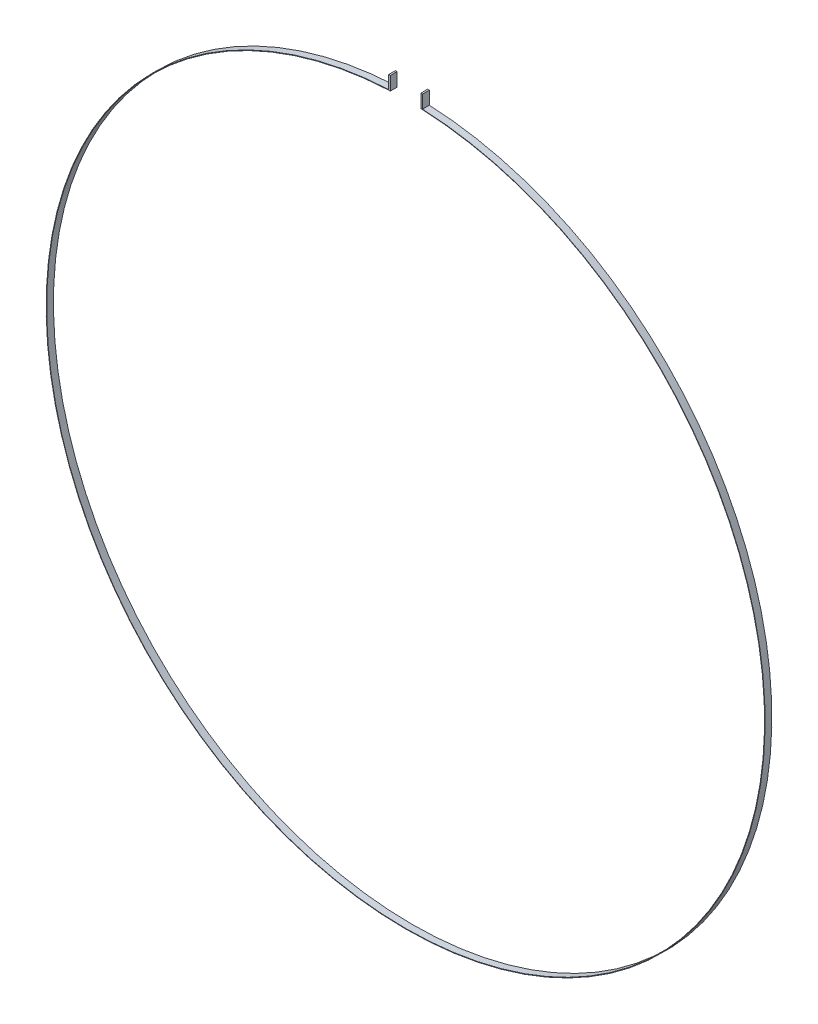
ISO-10303-21;
HEADER;
FILE_DESCRIPTION(('STEP AP214'),'2;1');
FILE_NAME('part.step','',(''),(''),'','','');
FILE_SCHEMA(('AUTOMOTIVE_DESIGN { 1 0 10303 214 1 1 1 1 }'));
ENDSEC;
DATA;
#1=APPLICATION_CONTEXT('core data for automotive mechanical design processes');
#2=APPLICATION_PROTOCOL_DEFINITION('international standard','automotive_design',2000,#1);
#3=PRODUCT_CONTEXT('',#1,'mechanical');
#4=PRODUCT('Part','Part','',(#3));
#5=PRODUCT_RELATED_PRODUCT_CATEGORY('part','',(#4));
#6=PRODUCT_DEFINITION_FORMATION('','',#4);
#7=PRODUCT_DEFINITION_CONTEXT('part definition',#1,'design');
#8=PRODUCT_DEFINITION('design','',#6,#7);
#9=PRODUCT_DEFINITION_SHAPE('','',#8);
#10=(LENGTH_UNIT() NAMED_UNIT(*) SI_UNIT(.MILLI.,.METRE.));
#11=(NAMED_UNIT(*) PLANE_ANGLE_UNIT() SI_UNIT($,.RADIAN.));
#12=(NAMED_UNIT(*) SI_UNIT($,.STERADIAN.) SOLID_ANGLE_UNIT());
#13=UNCERTAINTY_MEASURE_WITH_UNIT(LENGTH_MEASURE(1.E-05),#10,'distance_accuracy_value','');
#14=(GEOMETRIC_REPRESENTATION_CONTEXT(3) GLOBAL_UNCERTAINTY_ASSIGNED_CONTEXT((#13)) GLOBAL_UNIT_ASSIGNED_CONTEXT((#10,
#11,#12)) REPRESENTATION_CONTEXT('',''));
#15=CARTESIAN_POINT('',(0.,0.,0.));
#16=DIRECTION('',(0.,0.,1.));
#17=DIRECTION('',(1.,0.,0.));
#18=AXIS2_PLACEMENT_3D('',#15,#16,#17);
#19=CARTESIAN_POINT('',(49.9999999999992,1058.82009803366,20.));
#20=DIRECTION('',(0.,1.,0.));
#21=DIRECTION('',(0.,0.,1.));
#22=AXIS2_PLACEMENT_3D('',#19,#20,#21);
#23=PLANE('',#22);
#24=DIRECTION('',(1.,0.,0.));
#25=VECTOR('',#24,1.);
#26=CARTESIAN_POINT('',(49.9999999999992,1058.82009803366,20.));
#27=LINE('',#26,#25);
#28=CARTESIAN_POINT('',(44.9999999999992,1058.82009803366,20.));
#29=VERTEX_POINT('',#28);
#30=CARTESIAN_POINT('',(49.9999999999992,1058.82009803366,20.));
#31=VERTEX_POINT('',#30);
#32=EDGE_CURVE('E121',#29,#31,#27,.T.);
#33=ORIENTED_EDGE('',*,*,#32,.F.);
#34=DIRECTION('',(0.,0.,-1.));
#35=VECTOR('',#34,1.);
#36=CARTESIAN_POINT('',(44.9999999999992,1058.82009803366,20.));
#37=LINE('',#36,#35);
#38=CARTESIAN_POINT('',(44.9999999999992,1058.82009803366,0.));
#39=VERTEX_POINT('',#38);
#40=EDGE_CURVE('E108',#29,#39,#37,.T.);
#41=ORIENTED_EDGE('',*,*,#40,.T.);
#42=DIRECTION('',(1.,0.,0.));
#43=VECTOR('',#42,1.);
#44=CARTESIAN_POINT('',(49.9999999999992,1058.82009803366,0.));
#45=LINE('',#44,#43);
#46=CARTESIAN_POINT('',(49.9999999999992,1058.82009803366,0.));
#47=VERTEX_POINT('',#46);
#48=EDGE_CURVE('E145',#39,#47,#45,.T.);
#49=ORIENTED_EDGE('',*,*,#48,.T.);
#50=DIRECTION('',(0.,0.,-1.));
#51=VECTOR('',#50,1.);
#52=CARTESIAN_POINT('',(49.9999999999992,1058.82009803366,20.));
#53=LINE('',#52,#51);
#54=EDGE_CURVE('E128',#31,#47,#53,.T.);
#55=ORIENTED_EDGE('',*,*,#54,.F.);
#56=EDGE_LOOP('',(#33,#41,#49,#55));
#57=FACE_BOUND('',#56,.T.);
#58=ADVANCED_FACE('F34',(#57),#23,.F.);
#59=CARTESIAN_POINT('',(50.0000000000006,1098.82009803366,20.));
#60=DIRECTION('',(0.,-1.,0.));
#61=DIRECTION('',(0.,0.,-1.));
#62=AXIS2_PLACEMENT_3D('',#59,#60,#61);
#63=PLANE('',#62);
#64=DIRECTION('',(-1.,0.,0.));
#65=VECTOR('',#64,1.);
#66=CARTESIAN_POINT('',(50.0000000000006,1098.82009803366,0.));
#67=LINE('',#66,#65);
#68=CARTESIAN_POINT('',(50.0000000000006,1098.82009803366,0.));
#69=VERTEX_POINT('',#68);
#70=CARTESIAN_POINT('',(44.9999999999992,1098.82009803366,0.));
#71=VERTEX_POINT('',#70);
#72=EDGE_CURVE('E136',#69,#71,#67,.T.);
#73=ORIENTED_EDGE('',*,*,#72,.T.);
#74=DIRECTION('',(0.,0.,1.));
#75=VECTOR('',#74,1.);
#76=CARTESIAN_POINT('',(44.9999999999992,1098.82009803366,20.));
#77=LINE('',#76,#75);
#78=CARTESIAN_POINT('',(44.9999999999992,1098.82009803366,20.));
#79=VERTEX_POINT('',#78);
#80=EDGE_CURVE('E11',#71,#79,#77,.T.);
#81=ORIENTED_EDGE('',*,*,#80,.T.);
#82=DIRECTION('',(-1.,0.,0.));
#83=VECTOR('',#82,1.);
#84=CARTESIAN_POINT('',(50.0000000000006,1098.82009803366,20.));
#85=LINE('',#84,#83);
#86=CARTESIAN_POINT('',(50.0000000000006,1098.82009803366,20.));
#87=VERTEX_POINT('',#86);
#88=EDGE_CURVE('E124',#87,#79,#85,.T.);
#89=ORIENTED_EDGE('',*,*,#88,.F.);
#90=DIRECTION('',(0.,0.,-1.));
#91=VECTOR('',#90,1.);
#92=CARTESIAN_POINT('',(50.0000000000006,1098.82009803366,20.));
#93=LINE('',#92,#91);
#94=EDGE_CURVE('E156',#87,#69,#93,.T.);
#95=ORIENTED_EDGE('',*,*,#94,.T.);
#96=EDGE_LOOP('',(#73,#81,#89,#95));
#97=FACE_BOUND('',#96,.T.);
#98=ADVANCED_FACE('F201',(#97),#63,.F.);
#99=CARTESIAN_POINT('',(0.,0.,20.));
#100=DIRECTION('',(0.,0.,-1.));
#101=DIRECTION('',(-1.,0.,0.));
#102=AXIS2_PLACEMENT_3D('',#99,#100,#101);
#103=CYLINDRICAL_SURFACE('',#102,1061.5);
#104=DIRECTION('',(0.,0.,-1.));
#105=VECTOR('',#104,1.);
#106=CARTESIAN_POINT('',(-50.0000000000008,1060.32176720088,20.));
#107=LINE('',#106,#105);
#108=CARTESIAN_POINT('',(-50.0000000000008,1060.32176720088,0.));
#109=VERTEX_POINT('',#108);
#110=CARTESIAN_POINT('',(-50.0000000000008,1060.32176720088,20.));
#111=VERTEX_POINT('',#110);
#112=EDGE_CURVE('E165',#109,#111,#107,.F.);
#113=ORIENTED_EDGE('',*,*,#112,.F.);
#114=CARTESIAN_POINT('',(0.,0.,0.));
#115=DIRECTION('',(0.,0.,1.));
#116=DIRECTION('',(1.,0.,0.));
#117=AXIS2_PLACEMENT_3D('',#114,#115,#116);
#118=CIRCLE('',#117,1061.5);
#119=CARTESIAN_POINT('',(49.9999999999992,1060.32176720088,0.));
#120=VERTEX_POINT('',#119);
#121=EDGE_CURVE('E171',#109,#120,#118,.T.);
#122=ORIENTED_EDGE('',*,*,#121,.T.);
#123=DIRECTION('',(0.,0.,-1.));
#124=VECTOR('',#123,1.);
#125=CARTESIAN_POINT('',(49.9999999999992,1060.32176720088,20.));
#126=LINE('',#125,#124);
#127=CARTESIAN_POINT('',(49.9999999999992,1060.32176720088,20.));
#128=VERTEX_POINT('',#127);
#129=EDGE_CURVE('E162',#128,#120,#126,.T.);
#130=ORIENTED_EDGE('',*,*,#129,.F.);
#131=CARTESIAN_POINT('',(0.,0.,20.));
#132=DIRECTION('',(0.,0.,1.));
#133=DIRECTION('',(1.,0.,0.));
#134=AXIS2_PLACEMENT_3D('',#131,#132,#133);
#135=CIRCLE('',#134,1061.5);
#136=EDGE_CURVE('E174',#111,#128,#135,.T.);
#137=ORIENTED_EDGE('',*,*,#136,.F.);
#138=EDGE_LOOP('',(#113,#122,#130,#137));
#139=FACE_BOUND('',#138,.T.);
#140=ADVANCED_FACE('F36',(#139),#103,.T.);
#141=CARTESIAN_POINT('',(0.,0.,20.));
#142=DIRECTION('',(0.,0.,-1.));
#143=DIRECTION('',(-1.,0.,0.));
#144=AXIS2_PLACEMENT_3D('',#141,#142,#143);
#145=CYLINDRICAL_SURFACE('',#144,1060.);
#146=CARTESIAN_POINT('',(0.,0.,0.));
#147=DIRECTION('',(0.,0.,1.));
#148=DIRECTION('',(1.,0.,0.));
#149=AXIS2_PLACEMENT_3D('',#146,#147,#148);
#150=CIRCLE('',#149,1060.);
#151=CARTESIAN_POINT('',(-50.0000000000017,1058.82009803366,0.));
#152=VERTEX_POINT('',#151);
#153=EDGE_CURVE('E168',#152,#47,#150,.T.);
#154=ORIENTED_EDGE('',*,*,#153,.F.);
#155=DIRECTION('',(0.,0.,-1.));
#156=VECTOR('',#155,1.);
#157=CARTESIAN_POINT('',(-50.0000000000008,1058.82009803366,20.));
#158=LINE('',#157,#156);
#159=CARTESIAN_POINT('',(-50.0000000000008,1058.82009803366,20.));
#160=VERTEX_POINT('',#159);
#161=EDGE_CURVE('E160',#160,#152,#158,.T.);
#162=ORIENTED_EDGE('',*,*,#161,.F.);
#163=CARTESIAN_POINT('',(0.,0.,20.));
#164=DIRECTION('',(0.,0.,1.));
#165=DIRECTION('',(1.,0.,0.));
#166=AXIS2_PLACEMENT_3D('',#163,#164,#165);
#167=CIRCLE('',#166,1060.);
#168=EDGE_CURVE('E169',#160,#31,#167,.T.);
#169=ORIENTED_EDGE('',*,*,#168,.T.);
#170=ORIENTED_EDGE('',*,*,#54,.T.);
#171=EDGE_LOOP('',(#154,#162,#169,#170));
#172=FACE_BOUND('',#171,.T.);
#173=ADVANCED_FACE('F207',(#172),#145,.F.);
#174=CARTESIAN_POINT('',(0.,0.,20.));
#175=DIRECTION('',(0.,0.,1.));
#176=DIRECTION('',(1.,0.,0.));
#177=AXIS2_PLACEMENT_3D('',#174,#175,#176);
#178=PLANE('',#177);
#179=DIRECTION('',(0.,1.,0.));
#180=VECTOR('',#179,1.);
#181=CARTESIAN_POINT('',(44.9999999999992,1799.39342932012,20.));
#182=LINE('',#181,#180);
#183=EDGE_CURVE('E49',#29,#79,#182,.T.);
#184=ORIENTED_EDGE('',*,*,#183,.F.);
#185=ORIENTED_EDGE('',*,*,#32,.T.);
#186=ORIENTED_EDGE('',*,*,#168,.F.);
#187=CARTESIAN_POINT('',(-44.9999999999992,1058.82009803366,20.));
#188=VERTEX_POINT('',#187);
#189=EDGE_CURVE('E130',#160,#188,#27,.T.);
#190=ORIENTED_EDGE('',*,*,#189,.T.);
#191=DIRECTION('',(0.,-1.,0.));
#192=VECTOR('',#191,1.);
#193=CARTESIAN_POINT('',(-44.9999999999992,1799.39342932012,20.));
#194=LINE('',#193,#192);
#195=CARTESIAN_POINT('',(-44.9999999999992,1098.82009803366,20.));
#196=VERTEX_POINT('',#195);
#197=EDGE_CURVE('E125',#196,#188,#194,.T.);
#198=ORIENTED_EDGE('',*,*,#197,.F.);
#199=CARTESIAN_POINT('',(-49.9999999999994,1098.82009803366,20.));
#200=VERTEX_POINT('',#199);
#201=EDGE_CURVE('E140',#196,#200,#85,.T.);
#202=ORIENTED_EDGE('',*,*,#201,.T.);
#203=DIRECTION('',(0.,-1.,0.));
#204=VECTOR('',#203,1.);
#205=CARTESIAN_POINT('',(-49.9999999999994,1098.82009803366,20.));
#206=LINE('',#205,#204);
#207=EDGE_CURVE('E131',#200,#111,#206,.T.);
#208=ORIENTED_EDGE('',*,*,#207,.T.);
#209=ORIENTED_EDGE('',*,*,#136,.T.);
#210=DIRECTION('',(0.,1.,0.));
#211=VECTOR('',#210,1.);
#212=CARTESIAN_POINT('',(50.0000000000006,1098.82009803366,20.));
#213=LINE('',#212,#211);
#214=EDGE_CURVE('E134',#128,#87,#213,.T.);
#215=ORIENTED_EDGE('',*,*,#214,.T.);
#216=ORIENTED_EDGE('',*,*,#88,.T.);
#217=EDGE_LOOP('',(#184,#185,#186,#190,#198,#202,#208,#209,#215,#216));
#218=FACE_BOUND('',#217,.T.);
#219=ADVANCED_FACE('F119',(#218),#178,.T.);
#220=CARTESIAN_POINT('',(0.,0.,0.));
#221=DIRECTION('',(0.,0.,1.));
#222=DIRECTION('',(1.,0.,0.));
#223=AXIS2_PLACEMENT_3D('',#220,#221,#222);
#224=PLANE('',#223);
#225=ORIENTED_EDGE('',*,*,#48,.F.);
#226=DIRECTION('',(0.,1.,0.));
#227=VECTOR('',#226,1.);
#228=CARTESIAN_POINT('',(44.9999999999992,0.,0.));
#229=LINE('',#228,#227);
#230=EDGE_CURVE('E111',#39,#71,#229,.T.);
#231=ORIENTED_EDGE('',*,*,#230,.T.);
#232=ORIENTED_EDGE('',*,*,#72,.F.);
#233=DIRECTION('',(0.,1.,0.));
#234=VECTOR('',#233,1.);
#235=CARTESIAN_POINT('',(50.0000000000006,1098.82009803366,0.));
#236=LINE('',#235,#234);
#237=EDGE_CURVE('E149',#120,#69,#236,.T.);
#238=ORIENTED_EDGE('',*,*,#237,.F.);
#239=ORIENTED_EDGE('',*,*,#121,.F.);
#240=DIRECTION('',(0.,-1.,0.));
#241=VECTOR('',#240,1.);
#242=CARTESIAN_POINT('',(-49.9999999999994,1098.82009803366,0.));
#243=LINE('',#242,#241);
#244=CARTESIAN_POINT('',(-49.9999999999994,1098.82009803366,0.));
#245=VERTEX_POINT('',#244);
#246=EDGE_CURVE('E115',#245,#109,#243,.T.);
#247=ORIENTED_EDGE('',*,*,#246,.F.);
#248=CARTESIAN_POINT('',(-44.9999999999992,1098.82009803366,0.));
#249=VERTEX_POINT('',#248);
#250=EDGE_CURVE('E151',#249,#245,#67,.T.);
#251=ORIENTED_EDGE('',*,*,#250,.F.);
#252=DIRECTION('',(0.,-1.,0.));
#253=VECTOR('',#252,1.);
#254=CARTESIAN_POINT('',(-44.9999999999992,0.,0.));
#255=LINE('',#254,#253);
#256=CARTESIAN_POINT('',(-44.9999999999992,1058.82009803366,0.));
#257=VERTEX_POINT('',#256);
#258=EDGE_CURVE('E56',#249,#257,#255,.T.);
#259=ORIENTED_EDGE('',*,*,#258,.T.);
#260=EDGE_CURVE('E146',#152,#257,#45,.T.);
#261=ORIENTED_EDGE('',*,*,#260,.F.);
#262=ORIENTED_EDGE('',*,*,#153,.T.);
#263=EDGE_LOOP('',(#225,#231,#232,#238,#239,#247,#251,#259,#261,#262));
#264=FACE_BOUND('',#263,.T.);
#265=ADVANCED_FACE('F185',(#264),#224,.F.);
#266=ORIENTED_EDGE('',*,*,#260,.T.);
#267=DIRECTION('',(0.,0.,1.));
#268=VECTOR('',#267,1.);
#269=CARTESIAN_POINT('',(-44.9999999999992,1058.82009803366,20.));
#270=LINE('',#269,#268);
#271=EDGE_CURVE('E195',#257,#188,#270,.T.);
#272=ORIENTED_EDGE('',*,*,#271,.T.);
#273=ORIENTED_EDGE('',*,*,#189,.F.);
#274=ORIENTED_EDGE('',*,*,#161,.T.);
#275=EDGE_LOOP('',(#266,#272,#273,#274));
#276=FACE_BOUND('',#275,.T.);
#277=ADVANCED_FACE('F217',(#276),#23,.F.);
#278=CARTESIAN_POINT('',(-49.9999999999994,1098.82009803366,20.));
#279=DIRECTION('',(1.,0.,0.));
#280=DIRECTION('',(0.,1.,0.));
#281=AXIS2_PLACEMENT_3D('',#278,#279,#280);
#282=PLANE('',#281);
#283=ORIENTED_EDGE('',*,*,#246,.T.);
#284=ORIENTED_EDGE('',*,*,#112,.T.);
#285=ORIENTED_EDGE('',*,*,#207,.F.);
#286=DIRECTION('',(0.,0.,-1.));
#287=VECTOR('',#286,1.);
#288=CARTESIAN_POINT('',(-49.9999999999994,1098.82009803366,20.));
#289=LINE('',#288,#287);
#290=EDGE_CURVE('E142',#200,#245,#289,.T.);
#291=ORIENTED_EDGE('',*,*,#290,.T.);
#292=EDGE_LOOP('',(#283,#284,#285,#291));
#293=FACE_BOUND('',#292,.T.);
#294=ADVANCED_FACE('F190',(#293),#282,.F.);
#295=CARTESIAN_POINT('',(50.0000000000006,1098.82009803366,20.));
#296=DIRECTION('',(-1.,0.,0.));
#297=DIRECTION('',(0.,-1.,0.));
#298=AXIS2_PLACEMENT_3D('',#295,#296,#297);
#299=PLANE('',#298);
#300=ORIENTED_EDGE('',*,*,#214,.F.);
#301=ORIENTED_EDGE('',*,*,#129,.T.);
#302=ORIENTED_EDGE('',*,*,#237,.T.);
#303=ORIENTED_EDGE('',*,*,#94,.F.);
#304=EDGE_LOOP('',(#300,#301,#302,#303));
#305=FACE_BOUND('',#304,.T.);
#306=ADVANCED_FACE('F204',(#305),#299,.F.);
#307=ORIENTED_EDGE('',*,*,#201,.F.);
#308=DIRECTION('',(0.,0.,-1.));
#309=VECTOR('',#308,1.);
#310=CARTESIAN_POINT('',(-44.9999999999992,1098.82009803366,20.));
#311=LINE('',#310,#309);
#312=EDGE_CURVE('E42',#196,#249,#311,.T.);
#313=ORIENTED_EDGE('',*,*,#312,.T.);
#314=ORIENTED_EDGE('',*,*,#250,.T.);
#315=ORIENTED_EDGE('',*,*,#290,.F.);
#316=EDGE_LOOP('',(#307,#313,#314,#315));
#317=FACE_BOUND('',#316,.T.);
#318=ADVANCED_FACE('F180',(#317),#63,.F.);
#319=CARTESIAN_POINT('',(-44.9999999999992,1799.39342932012,-20.));
#320=DIRECTION('',(-1.,0.,0.));
#321=DIRECTION('',(0.,0.,1.));
#322=AXIS2_PLACEMENT_3D('',#319,#320,#321);
#323=PLANE('',#322);
#324=ORIENTED_EDGE('',*,*,#258,.F.);
#325=ORIENTED_EDGE('',*,*,#312,.F.);
#326=ORIENTED_EDGE('',*,*,#197,.T.);
#327=ORIENTED_EDGE('',*,*,#271,.F.);
#328=EDGE_LOOP('',(#324,#325,#326,#327));
#329=FACE_BOUND('',#328,.T.);
#330=ADVANCED_FACE('F230',(#329),#323,.F.);
#331=CARTESIAN_POINT('',(44.9999999999992,1799.39342932012,-20.));
#332=DIRECTION('',(1.,0.,0.));
#333=DIRECTION('',(0.,1.,0.));
#334=AXIS2_PLACEMENT_3D('',#331,#332,#333);
#335=PLANE('',#334);
#336=ORIENTED_EDGE('',*,*,#183,.T.);
#337=ORIENTED_EDGE('',*,*,#80,.F.);
#338=ORIENTED_EDGE('',*,*,#230,.F.);
#339=ORIENTED_EDGE('',*,*,#40,.F.);
#340=EDGE_LOOP('',(#336,#337,#338,#339));
#341=FACE_BOUND('',#340,.T.);
#342=ADVANCED_FACE('F109',(#341),#335,.F.);
#343=CLOSED_SHELL('',(#58,#98,#140,#173,#219,#265,#277,#294,#306,#318,#330,#342));
#344=MANIFOLD_SOLID_BREP('B2',#343);
#345=ADVANCED_BREP_SHAPE_REPRESENTATION('',(#18,#344),#14);
#346=SHAPE_DEFINITION_REPRESENTATION(#9,#345);
ENDSEC;
END-ISO-10303-21;
